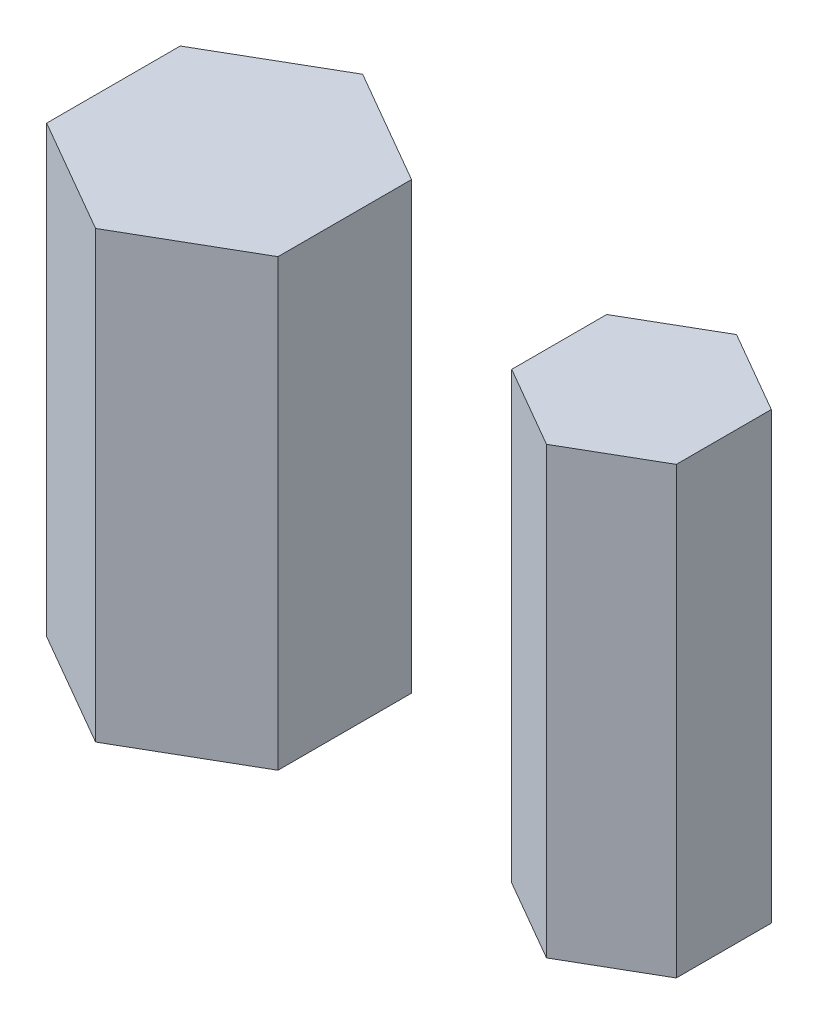
ISO-10303-21;
HEADER;
FILE_DESCRIPTION(('STEP AP214'),'2;1');
FILE_NAME('part.step','',(''),(''),'','','');
FILE_SCHEMA(('AUTOMOTIVE_DESIGN { 1 0 10303 214 1 1 1 1 }'));
ENDSEC;
DATA;
#1=APPLICATION_CONTEXT('core data for automotive mechanical design processes');
#2=APPLICATION_PROTOCOL_DEFINITION('international standard','automotive_design',2000,#1);
#3=PRODUCT_CONTEXT('',#1,'mechanical');
#4=PRODUCT('Part','Part','',(#3));
#5=PRODUCT_RELATED_PRODUCT_CATEGORY('part','',(#4));
#6=PRODUCT_DEFINITION_FORMATION('','',#4);
#7=PRODUCT_DEFINITION_CONTEXT('part definition',#1,'design');
#8=PRODUCT_DEFINITION('design','',#6,#7);
#9=PRODUCT_DEFINITION_SHAPE('','',#8);
#10=(LENGTH_UNIT() NAMED_UNIT(*) SI_UNIT(.MILLI.,.METRE.));
#11=(NAMED_UNIT(*) PLANE_ANGLE_UNIT() SI_UNIT($,.RADIAN.));
#12=(NAMED_UNIT(*) SI_UNIT($,.STERADIAN.) SOLID_ANGLE_UNIT());
#13=UNCERTAINTY_MEASURE_WITH_UNIT(LENGTH_MEASURE(1.E-05),#10,'distance_accuracy_value','');
#14=(GEOMETRIC_REPRESENTATION_CONTEXT(3) GLOBAL_UNCERTAINTY_ASSIGNED_CONTEXT((#13)) GLOBAL_UNIT_ASSIGNED_CONTEXT((#10,
#11,#12)) REPRESENTATION_CONTEXT('',''));
#15=CARTESIAN_POINT('',(0.,0.,0.));
#16=DIRECTION('',(0.,0.,1.));
#17=DIRECTION('',(1.,0.,0.));
#18=AXIS2_PLACEMENT_3D('',#15,#16,#17);
#19=CARTESIAN_POINT('',(7.42131819136626,10.,1.06809799800081));
#20=DIRECTION('',(0.5,0.,-0.866025403784438));
#21=DIRECTION('',(-0.866025403784438,0.,-0.5));
#22=AXIS2_PLACEMENT_3D('',#19,#20,#21);
#23=PLANE('',#22);
#24=DIRECTION('',(0.866025403784438,0.,0.5));
#25=VECTOR('',#24,1.);
#26=CARTESIAN_POINT('',(7.42131819136626,0.,1.06809799800081));
#27=LINE('',#26,#25);
#28=CARTESIAN_POINT('',(7.42131819136626,0.,1.06809799800081));
#29=VERTEX_POINT('',#28);
#30=CARTESIAN_POINT('',(9.27131819136626,0.,2.13619599600162));
#31=VERTEX_POINT('',#30);
#32=EDGE_CURVE('E126',#29,#31,#27,.T.);
#33=ORIENTED_EDGE('',*,*,#32,.T.);
#34=DIRECTION('',(0.,-1.,0.));
#35=VECTOR('',#34,1.);
#36=CARTESIAN_POINT('',(9.27131819136626,10.,2.13619599600162));
#37=LINE('',#36,#35);
#38=CARTESIAN_POINT('',(9.27131819136626,10.,2.13619599600162));
#39=VERTEX_POINT('',#38);
#40=EDGE_CURVE('E12',#39,#31,#37,.T.);
#41=ORIENTED_EDGE('',*,*,#40,.F.);
#42=DIRECTION('',(0.866025403784438,0.,0.5));
#43=VECTOR('',#42,1.);
#44=CARTESIAN_POINT('',(7.42131819136626,10.,1.06809799800081));
#45=LINE('',#44,#43);
#46=CARTESIAN_POINT('',(7.42131819136626,10.,1.06809799800081));
#47=VERTEX_POINT('',#46);
#48=EDGE_CURVE('E136',#47,#39,#45,.T.);
#49=ORIENTED_EDGE('',*,*,#48,.F.);
#50=DIRECTION('',(0.,-1.,0.));
#51=VECTOR('',#50,1.);
#52=CARTESIAN_POINT('',(7.42131819136626,10.,1.06809799800081));
#53=LINE('',#52,#51);
#54=EDGE_CURVE('E122',#47,#29,#53,.T.);
#55=ORIENTED_EDGE('',*,*,#54,.T.);
#56=EDGE_LOOP('',(#33,#41,#49,#55));
#57=FACE_BOUND('',#56,.T.);
#58=ADVANCED_FACE('F42',(#57),#23,.F.);
#59=CARTESIAN_POINT('',(9.27131819136626,10.,2.13619599600162));
#60=DIRECTION('',(-0.5,0.,-0.866025403784438));
#61=DIRECTION('',(-0.866025403784439,0.,0.5));
#62=AXIS2_PLACEMENT_3D('',#59,#60,#61);
#63=PLANE('',#62);
#64=DIRECTION('',(0.866025403784438,0.,-0.5));
#65=VECTOR('',#64,1.);
#66=CARTESIAN_POINT('',(9.27131819136626,0.,2.13619599600162));
#67=LINE('',#66,#65);
#68=CARTESIAN_POINT('',(11.1213181913663,0.,1.06809799800081));
#69=VERTEX_POINT('',#68);
#70=EDGE_CURVE('E129',#31,#69,#67,.T.);
#71=ORIENTED_EDGE('',*,*,#70,.T.);
#72=DIRECTION('',(0.,-1.,0.));
#73=VECTOR('',#72,1.);
#74=CARTESIAN_POINT('',(11.1213181913663,10.,1.06809799800081));
#75=LINE('',#74,#73);
#76=CARTESIAN_POINT('',(11.1213181913663,10.,1.06809799800081));
#77=VERTEX_POINT('',#76);
#78=EDGE_CURVE('E50',#77,#69,#75,.T.);
#79=ORIENTED_EDGE('',*,*,#78,.F.);
#80=DIRECTION('',(0.866025403784438,0.,-0.5));
#81=VECTOR('',#80,1.);
#82=CARTESIAN_POINT('',(9.27131819136626,10.,2.13619599600162));
#83=LINE('',#82,#81);
#84=EDGE_CURVE('E95',#39,#77,#83,.T.);
#85=ORIENTED_EDGE('',*,*,#84,.F.);
#86=ORIENTED_EDGE('',*,*,#40,.T.);
#87=EDGE_LOOP('',(#71,#79,#85,#86));
#88=FACE_BOUND('',#87,.T.);
#89=ADVANCED_FACE('F160',(#88),#63,.F.);
#90=CARTESIAN_POINT('',(11.1213181913663,10.,1.06809799800081));
#91=DIRECTION('',(-1.,0.,0.));
#92=DIRECTION('',(0.,0.,1.));
#93=AXIS2_PLACEMENT_3D('',#90,#91,#92);
#94=PLANE('',#93);
#95=DIRECTION('',(0.,0.,-1.));
#96=VECTOR('',#95,1.);
#97=CARTESIAN_POINT('',(11.1213181913663,0.,1.06809799800081));
#98=LINE('',#97,#96);
#99=CARTESIAN_POINT('',(11.1213181913663,0.,-1.06809799800081));
#100=VERTEX_POINT('',#99);
#101=EDGE_CURVE('E131',#69,#100,#98,.T.);
#102=ORIENTED_EDGE('',*,*,#101,.T.);
#103=DIRECTION('',(0.,-1.,0.));
#104=VECTOR('',#103,1.);
#105=CARTESIAN_POINT('',(11.1213181913663,10.,-1.06809799800081));
#106=LINE('',#105,#104);
#107=CARTESIAN_POINT('',(11.1213181913663,10.,-1.06809799800081));
#108=VERTEX_POINT('',#107);
#109=EDGE_CURVE('E117',#108,#100,#106,.T.);
#110=ORIENTED_EDGE('',*,*,#109,.F.);
#111=DIRECTION('',(0.,0.,-1.));
#112=VECTOR('',#111,1.);
#113=CARTESIAN_POINT('',(11.1213181913663,10.,1.06809799800081));
#114=LINE('',#113,#112);
#115=EDGE_CURVE('E108',#77,#108,#114,.T.);
#116=ORIENTED_EDGE('',*,*,#115,.F.);
#117=ORIENTED_EDGE('',*,*,#78,.T.);
#118=EDGE_LOOP('',(#102,#110,#116,#117));
#119=FACE_BOUND('',#118,.T.);
#120=ADVANCED_FACE('F142',(#119),#94,.F.);
#121=CARTESIAN_POINT('',(11.1213181913663,10.,-1.06809799800081));
#122=DIRECTION('',(-0.5,0.,0.866025403784439));
#123=DIRECTION('',(0.866025403784439,0.,0.5));
#124=AXIS2_PLACEMENT_3D('',#121,#122,#123);
#125=PLANE('',#124);
#126=DIRECTION('',(-0.866025403784439,0.,-0.5));
#127=VECTOR('',#126,1.);
#128=CARTESIAN_POINT('',(11.1213181913663,0.,-1.06809799800081));
#129=LINE('',#128,#127);
#130=CARTESIAN_POINT('',(9.27131819136626,0.,-2.13619599600161));
#131=VERTEX_POINT('',#130);
#132=EDGE_CURVE('E116',#100,#131,#129,.T.);
#133=ORIENTED_EDGE('',*,*,#132,.T.);
#134=DIRECTION('',(0.,-1.,0.));
#135=VECTOR('',#134,1.);
#136=CARTESIAN_POINT('',(9.27131819136626,10.,-2.13619599600161));
#137=LINE('',#136,#135);
#138=CARTESIAN_POINT('',(9.27131819136626,10.,-2.13619599600161));
#139=VERTEX_POINT('',#138);
#140=EDGE_CURVE('E113',#139,#131,#137,.T.);
#141=ORIENTED_EDGE('',*,*,#140,.F.);
#142=DIRECTION('',(-0.866025403784439,0.,-0.5));
#143=VECTOR('',#142,1.);
#144=CARTESIAN_POINT('',(11.1213181913663,10.,-1.06809799800081));
#145=LINE('',#144,#143);
#146=EDGE_CURVE('E102',#108,#139,#145,.T.);
#147=ORIENTED_EDGE('',*,*,#146,.F.);
#148=ORIENTED_EDGE('',*,*,#109,.T.);
#149=EDGE_LOOP('',(#133,#141,#147,#148));
#150=FACE_BOUND('',#149,.T.);
#151=ADVANCED_FACE('F114',(#150),#125,.F.);
#152=CARTESIAN_POINT('',(9.27131819136626,10.,-2.13619599600161));
#153=DIRECTION('',(0.5,0.,0.866025403784438));
#154=DIRECTION('',(0.866025403784439,0.,-0.5));
#155=AXIS2_PLACEMENT_3D('',#152,#153,#154);
#156=PLANE('',#155);
#157=DIRECTION('',(-0.866025403784439,0.,0.5));
#158=VECTOR('',#157,1.);
#159=CARTESIAN_POINT('',(9.27131819136626,0.,-2.13619599600161));
#160=LINE('',#159,#158);
#161=CARTESIAN_POINT('',(7.42131819136626,0.,-1.06809799800081));
#162=VERTEX_POINT('',#161);
#163=EDGE_CURVE('E81',#131,#162,#160,.T.);
#164=ORIENTED_EDGE('',*,*,#163,.T.);
#165=DIRECTION('',(0.,-1.,0.));
#166=VECTOR('',#165,1.);
#167=CARTESIAN_POINT('',(7.42131819136626,10.,-1.06809799800081));
#168=LINE('',#167,#166);
#169=CARTESIAN_POINT('',(7.42131819136626,10.,-1.06809799800081));
#170=VERTEX_POINT('',#169);
#171=EDGE_CURVE('E118',#170,#162,#168,.T.);
#172=ORIENTED_EDGE('',*,*,#171,.F.);
#173=DIRECTION('',(-0.866025403784439,0.,0.5));
#174=VECTOR('',#173,1.);
#175=CARTESIAN_POINT('',(9.27131819136626,10.,-2.13619599600161));
#176=LINE('',#175,#174);
#177=EDGE_CURVE('E106',#139,#170,#176,.T.);
#178=ORIENTED_EDGE('',*,*,#177,.F.);
#179=ORIENTED_EDGE('',*,*,#140,.T.);
#180=EDGE_LOOP('',(#164,#172,#178,#179));
#181=FACE_BOUND('',#180,.T.);
#182=ADVANCED_FACE('F120',(#181),#156,.F.);
#183=CARTESIAN_POINT('',(7.42131819136626,10.,-1.06809799800081));
#184=DIRECTION('',(1.,0.,0.));
#185=DIRECTION('',(0.,0.,-1.));
#186=AXIS2_PLACEMENT_3D('',#183,#184,#185);
#187=PLANE('',#186);
#188=DIRECTION('',(0.,0.,1.));
#189=VECTOR('',#188,1.);
#190=CARTESIAN_POINT('',(7.42131819136626,0.,-1.06809799800081));
#191=LINE('',#190,#189);
#192=EDGE_CURVE('E87',#162,#29,#191,.T.);
#193=ORIENTED_EDGE('',*,*,#192,.T.);
#194=ORIENTED_EDGE('',*,*,#54,.F.);
#195=DIRECTION('',(0.,0.,1.));
#196=VECTOR('',#195,1.);
#197=CARTESIAN_POINT('',(7.42131819136626,10.,-1.06809799800081));
#198=LINE('',#197,#196);
#199=EDGE_CURVE('E58',#170,#47,#198,.T.);
#200=ORIENTED_EDGE('',*,*,#199,.F.);
#201=ORIENTED_EDGE('',*,*,#171,.T.);
#202=EDGE_LOOP('',(#193,#194,#200,#201));
#203=FACE_BOUND('',#202,.T.);
#204=ADVANCED_FACE('F149',(#203),#187,.F.);
#205=CARTESIAN_POINT('',(0.,10.,0.));
#206=DIRECTION('',(0.,1.,0.));
#207=DIRECTION('',(0.,0.,1.));
#208=AXIS2_PLACEMENT_3D('',#205,#206,#207);
#209=PLANE('',#208);
#210=ORIENTED_EDGE('',*,*,#48,.T.);
#211=ORIENTED_EDGE('',*,*,#84,.T.);
#212=ORIENTED_EDGE('',*,*,#115,.T.);
#213=ORIENTED_EDGE('',*,*,#146,.T.);
#214=ORIENTED_EDGE('',*,*,#177,.T.);
#215=ORIENTED_EDGE('',*,*,#199,.T.);
#216=EDGE_LOOP('',(#210,#211,#212,#213,#214,#215));
#217=FACE_BOUND('',#216,.T.);
#218=ADVANCED_FACE('F104',(#217),#209,.T.);
#219=CARTESIAN_POINT('',(0.,0.,0.));
#220=DIRECTION('',(0.,1.,0.));
#221=DIRECTION('',(0.,0.,1.));
#222=AXIS2_PLACEMENT_3D('',#219,#220,#221);
#223=PLANE('',#222);
#224=ORIENTED_EDGE('',*,*,#32,.F.);
#225=ORIENTED_EDGE('',*,*,#192,.F.);
#226=ORIENTED_EDGE('',*,*,#163,.F.);
#227=ORIENTED_EDGE('',*,*,#132,.F.);
#228=ORIENTED_EDGE('',*,*,#101,.F.);
#229=ORIENTED_EDGE('',*,*,#70,.F.);
#230=EDGE_LOOP('',(#224,#225,#226,#227,#228,#229));
#231=FACE_BOUND('',#230,.T.);
#232=ADVANCED_FACE('F145',(#231),#223,.F.);
#233=CLOSED_SHELL('',(#58,#89,#120,#151,#182,#204,#218,#232));
#234=MANIFOLD_SOLID_BREP('B2',#233);
#235=CARTESIAN_POINT('',(-2.6,10.,1.50111069989303));
#236=DIRECTION('',(0.5,0.,-0.866025403784439));
#237=DIRECTION('',(-0.866025403784439,0.,-0.5));
#238=AXIS2_PLACEMENT_3D('',#235,#236,#237);
#239=PLANE('',#238);
#240=DIRECTION('',(0.866025403784438,0.,0.5));
#241=VECTOR('',#240,1.);
#242=CARTESIAN_POINT('',(-2.6,0.,1.50111069989303));
#243=LINE('',#242,#241);
#244=CARTESIAN_POINT('',(-2.6,0.,1.50111069989303));
#245=VERTEX_POINT('',#244);
#246=CARTESIAN_POINT('',(0.,0.,3.00222139978605));
#247=VERTEX_POINT('',#246);
#248=EDGE_CURVE('E301',#245,#247,#243,.T.);
#249=ORIENTED_EDGE('',*,*,#248,.T.);
#250=DIRECTION('',(0.,-1.,0.));
#251=VECTOR('',#250,1.);
#252=CARTESIAN_POINT('',(0.,10.,3.00222139978605));
#253=LINE('',#252,#251);
#254=CARTESIAN_POINT('',(0.,10.,3.00222139978605));
#255=VERTEX_POINT('',#254);
#256=EDGE_CURVE('E40',#255,#247,#253,.T.);
#257=ORIENTED_EDGE('',*,*,#256,.F.);
#258=DIRECTION('',(0.866025403784438,0.,0.5));
#259=VECTOR('',#258,1.);
#260=CARTESIAN_POINT('',(-2.6,10.,1.50111069989303));
#261=LINE('',#260,#259);
#262=CARTESIAN_POINT('',(-2.6,10.,1.50111069989303));
#263=VERTEX_POINT('',#262);
#264=EDGE_CURVE('E311',#263,#255,#261,.T.);
#265=ORIENTED_EDGE('',*,*,#264,.F.);
#266=DIRECTION('',(0.,-1.,0.));
#267=VECTOR('',#266,1.);
#268=CARTESIAN_POINT('',(-2.6,10.,1.50111069989303));
#269=LINE('',#268,#267);
#270=EDGE_CURVE('E297',#263,#245,#269,.T.);
#271=ORIENTED_EDGE('',*,*,#270,.T.);
#272=EDGE_LOOP('',(#249,#257,#265,#271));
#273=FACE_BOUND('',#272,.T.);
#274=ADVANCED_FACE('F217',(#273),#239,.F.);
#275=CARTESIAN_POINT('',(0.,10.,3.00222139978605));
#276=DIRECTION('',(-0.5,0.,-0.866025403784439));
#277=DIRECTION('',(-0.866025403784439,0.,0.5));
#278=AXIS2_PLACEMENT_3D('',#275,#276,#277);
#279=PLANE('',#278);
#280=DIRECTION('',(0.866025403784439,0.,-0.5));
#281=VECTOR('',#280,1.);
#282=CARTESIAN_POINT('',(0.,0.,3.00222139978605));
#283=LINE('',#282,#281);
#284=CARTESIAN_POINT('',(2.6,0.,1.50111069989303));
#285=VERTEX_POINT('',#284);
#286=EDGE_CURVE('E304',#247,#285,#283,.T.);
#287=ORIENTED_EDGE('',*,*,#286,.T.);
#288=DIRECTION('',(0.,-1.,0.));
#289=VECTOR('',#288,1.);
#290=CARTESIAN_POINT('',(2.6,10.,1.50111069989303));
#291=LINE('',#290,#289);
#292=CARTESIAN_POINT('',(2.6,10.,1.50111069989303));
#293=VERTEX_POINT('',#292);
#294=EDGE_CURVE('E225',#293,#285,#291,.T.);
#295=ORIENTED_EDGE('',*,*,#294,.F.);
#296=DIRECTION('',(0.866025403784439,0.,-0.5));
#297=VECTOR('',#296,1.);
#298=CARTESIAN_POINT('',(0.,10.,3.00222139978605));
#299=LINE('',#298,#297);
#300=EDGE_CURVE('E270',#255,#293,#299,.T.);
#301=ORIENTED_EDGE('',*,*,#300,.F.);
#302=ORIENTED_EDGE('',*,*,#256,.T.);
#303=EDGE_LOOP('',(#287,#295,#301,#302));
#304=FACE_BOUND('',#303,.T.);
#305=ADVANCED_FACE('F335',(#304),#279,.F.);
#306=CARTESIAN_POINT('',(2.6,10.,1.50111069989303));
#307=DIRECTION('',(-1.,0.,0.));
#308=DIRECTION('',(0.,0.,1.));
#309=AXIS2_PLACEMENT_3D('',#306,#307,#308);
#310=PLANE('',#309);
#311=DIRECTION('',(0.,0.,-1.));
#312=VECTOR('',#311,1.);
#313=CARTESIAN_POINT('',(2.6,0.,1.50111069989303));
#314=LINE('',#313,#312);
#315=CARTESIAN_POINT('',(2.6,0.,-1.50111069989303));
#316=VERTEX_POINT('',#315);
#317=EDGE_CURVE('E306',#285,#316,#314,.T.);
#318=ORIENTED_EDGE('',*,*,#317,.T.);
#319=DIRECTION('',(0.,-1.,0.));
#320=VECTOR('',#319,1.);
#321=CARTESIAN_POINT('',(2.6,10.,-1.50111069989303));
#322=LINE('',#321,#320);
#323=CARTESIAN_POINT('',(2.6,10.,-1.50111069989303));
#324=VERTEX_POINT('',#323);
#325=EDGE_CURVE('E292',#324,#316,#322,.T.);
#326=ORIENTED_EDGE('',*,*,#325,.F.);
#327=DIRECTION('',(0.,0.,-1.));
#328=VECTOR('',#327,1.);
#329=CARTESIAN_POINT('',(2.6,10.,1.50111069989303));
#330=LINE('',#329,#328);
#331=EDGE_CURVE('E283',#293,#324,#330,.T.);
#332=ORIENTED_EDGE('',*,*,#331,.F.);
#333=ORIENTED_EDGE('',*,*,#294,.T.);
#334=EDGE_LOOP('',(#318,#326,#332,#333));
#335=FACE_BOUND('',#334,.T.);
#336=ADVANCED_FACE('F317',(#335),#310,.F.);
#337=CARTESIAN_POINT('',(2.6,10.,-1.50111069989303));
#338=DIRECTION('',(-0.5,0.,0.866025403784439));
#339=DIRECTION('',(0.866025403784439,0.,0.5));
#340=AXIS2_PLACEMENT_3D('',#337,#338,#339);
#341=PLANE('',#340);
#342=DIRECTION('',(-0.866025403784439,0.,-0.5));
#343=VECTOR('',#342,1.);
#344=CARTESIAN_POINT('',(2.6,0.,-1.50111069989303));
#345=LINE('',#344,#343);
#346=CARTESIAN_POINT('',(0.,0.,-3.00222139978605));
#347=VERTEX_POINT('',#346);
#348=EDGE_CURVE('E291',#316,#347,#345,.T.);
#349=ORIENTED_EDGE('',*,*,#348,.T.);
#350=DIRECTION('',(0.,-1.,0.));
#351=VECTOR('',#350,1.);
#352=CARTESIAN_POINT('',(0.,10.,-3.00222139978605));
#353=LINE('',#352,#351);
#354=CARTESIAN_POINT('',(0.,10.,-3.00222139978605));
#355=VERTEX_POINT('',#354);
#356=EDGE_CURVE('E288',#355,#347,#353,.T.);
#357=ORIENTED_EDGE('',*,*,#356,.F.);
#358=DIRECTION('',(-0.866025403784439,0.,-0.5));
#359=VECTOR('',#358,1.);
#360=CARTESIAN_POINT('',(2.6,10.,-1.50111069989303));
#361=LINE('',#360,#359);
#362=EDGE_CURVE('E277',#324,#355,#361,.T.);
#363=ORIENTED_EDGE('',*,*,#362,.F.);
#364=ORIENTED_EDGE('',*,*,#325,.T.);
#365=EDGE_LOOP('',(#349,#357,#363,#364));
#366=FACE_BOUND('',#365,.T.);
#367=ADVANCED_FACE('F289',(#366),#341,.F.);
#368=CARTESIAN_POINT('',(0.,10.,-3.00222139978605));
#369=DIRECTION('',(0.5,0.,0.866025403784439));
#370=DIRECTION('',(0.866025403784439,0.,-0.5));
#371=AXIS2_PLACEMENT_3D('',#368,#369,#370);
#372=PLANE('',#371);
#373=DIRECTION('',(-0.866025403784439,0.,0.5));
#374=VECTOR('',#373,1.);
#375=CARTESIAN_POINT('',(0.,0.,-3.00222139978605));
#376=LINE('',#375,#374);
#377=CARTESIAN_POINT('',(-2.6,0.,-1.50111069989303));
#378=VERTEX_POINT('',#377);
#379=EDGE_CURVE('E256',#347,#378,#376,.T.);
#380=ORIENTED_EDGE('',*,*,#379,.T.);
#381=DIRECTION('',(0.,-1.,0.));
#382=VECTOR('',#381,1.);
#383=CARTESIAN_POINT('',(-2.6,10.,-1.50111069989303));
#384=LINE('',#383,#382);
#385=CARTESIAN_POINT('',(-2.6,10.,-1.50111069989303));
#386=VERTEX_POINT('',#385);
#387=EDGE_CURVE('E293',#386,#378,#384,.T.);
#388=ORIENTED_EDGE('',*,*,#387,.F.);
#389=DIRECTION('',(-0.866025403784439,0.,0.5));
#390=VECTOR('',#389,1.);
#391=CARTESIAN_POINT('',(0.,10.,-3.00222139978605));
#392=LINE('',#391,#390);
#393=EDGE_CURVE('E281',#355,#386,#392,.T.);
#394=ORIENTED_EDGE('',*,*,#393,.F.);
#395=ORIENTED_EDGE('',*,*,#356,.T.);
#396=EDGE_LOOP('',(#380,#388,#394,#395));
#397=FACE_BOUND('',#396,.T.);
#398=ADVANCED_FACE('F295',(#397),#372,.F.);
#399=CARTESIAN_POINT('',(-2.6,10.,-1.50111069989303));
#400=DIRECTION('',(1.,0.,0.));
#401=DIRECTION('',(0.,0.,-1.));
#402=AXIS2_PLACEMENT_3D('',#399,#400,#401);
#403=PLANE('',#402);
#404=DIRECTION('',(0.,0.,1.));
#405=VECTOR('',#404,1.);
#406=CARTESIAN_POINT('',(-2.6,0.,-1.50111069989303));
#407=LINE('',#406,#405);
#408=EDGE_CURVE('E262',#378,#245,#407,.T.);
#409=ORIENTED_EDGE('',*,*,#408,.T.);
#410=ORIENTED_EDGE('',*,*,#270,.F.);
#411=DIRECTION('',(0.,0.,1.));
#412=VECTOR('',#411,1.);
#413=CARTESIAN_POINT('',(-2.6,10.,-1.50111069989303));
#414=LINE('',#413,#412);
#415=EDGE_CURVE('E233',#386,#263,#414,.T.);
#416=ORIENTED_EDGE('',*,*,#415,.F.);
#417=ORIENTED_EDGE('',*,*,#387,.T.);
#418=EDGE_LOOP('',(#409,#410,#416,#417));
#419=FACE_BOUND('',#418,.T.);
#420=ADVANCED_FACE('F324',(#419),#403,.F.);
#421=CARTESIAN_POINT('',(0.,10.,0.));
#422=DIRECTION('',(0.,1.,0.));
#423=DIRECTION('',(0.,0.,1.));
#424=AXIS2_PLACEMENT_3D('',#421,#422,#423);
#425=PLANE('',#424);
#426=ORIENTED_EDGE('',*,*,#264,.T.);
#427=ORIENTED_EDGE('',*,*,#300,.T.);
#428=ORIENTED_EDGE('',*,*,#331,.T.);
#429=ORIENTED_EDGE('',*,*,#362,.T.);
#430=ORIENTED_EDGE('',*,*,#393,.T.);
#431=ORIENTED_EDGE('',*,*,#415,.T.);
#432=EDGE_LOOP('',(#426,#427,#428,#429,#430,#431));
#433=FACE_BOUND('',#432,.T.);
#434=ADVANCED_FACE('F279',(#433),#425,.T.);
#435=CARTESIAN_POINT('',(0.,0.,0.));
#436=DIRECTION('',(0.,1.,0.));
#437=DIRECTION('',(0.,0.,1.));
#438=AXIS2_PLACEMENT_3D('',#435,#436,#437);
#439=PLANE('',#438);
#440=ORIENTED_EDGE('',*,*,#248,.F.);
#441=ORIENTED_EDGE('',*,*,#408,.F.);
#442=ORIENTED_EDGE('',*,*,#379,.F.);
#443=ORIENTED_EDGE('',*,*,#348,.F.);
#444=ORIENTED_EDGE('',*,*,#317,.F.);
#445=ORIENTED_EDGE('',*,*,#286,.F.);
#446=EDGE_LOOP('',(#440,#441,#442,#443,#444,#445));
#447=FACE_BOUND('',#446,.T.);
#448=ADVANCED_FACE('F320',(#447),#439,.F.);
#449=CLOSED_SHELL('',(#274,#305,#336,#367,#398,#420,#434,#448));
#450=MANIFOLD_SOLID_BREP('B6',#449);
#451=ADVANCED_BREP_SHAPE_REPRESENTATION('',(#18,#234,#450),#14);
#452=SHAPE_DEFINITION_REPRESENTATION(#9,#451);
ENDSEC;
END-ISO-10303-21;
